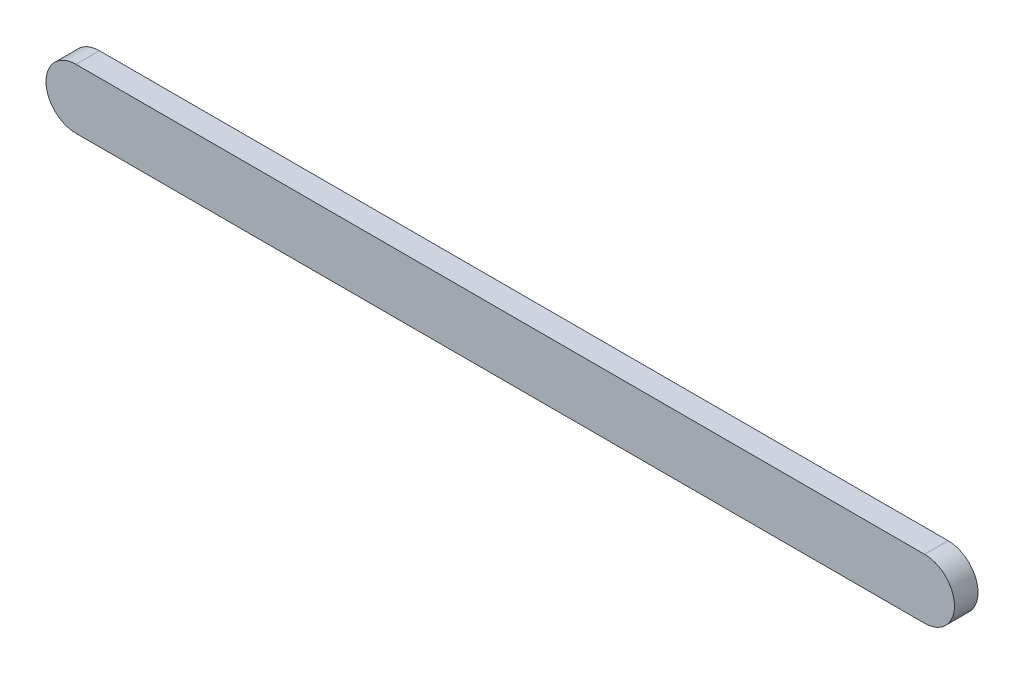
ISO-10303-21;
HEADER;
FILE_DESCRIPTION(('STEP AP214'),'2;1');
FILE_NAME('part.step','',(''),(''),'','','');
FILE_SCHEMA(('AUTOMOTIVE_DESIGN { 1 0 10303 214 1 1 1 1 }'));
ENDSEC;
DATA;
#1=APPLICATION_CONTEXT('core data for automotive mechanical design processes');
#2=APPLICATION_PROTOCOL_DEFINITION('international standard','automotive_design',2000,#1);
#3=PRODUCT_CONTEXT('',#1,'mechanical');
#4=PRODUCT('Part','Part','',(#3));
#5=PRODUCT_RELATED_PRODUCT_CATEGORY('part','',(#4));
#6=PRODUCT_DEFINITION_FORMATION('','',#4);
#7=PRODUCT_DEFINITION_CONTEXT('part definition',#1,'design');
#8=PRODUCT_DEFINITION('design','',#6,#7);
#9=PRODUCT_DEFINITION_SHAPE('','',#8);
#10=(LENGTH_UNIT() NAMED_UNIT(*) SI_UNIT(.MILLI.,.METRE.));
#11=(NAMED_UNIT(*) PLANE_ANGLE_UNIT() SI_UNIT($,.RADIAN.));
#12=(NAMED_UNIT(*) SI_UNIT($,.STERADIAN.) SOLID_ANGLE_UNIT());
#13=UNCERTAINTY_MEASURE_WITH_UNIT(LENGTH_MEASURE(1.E-05),#10,'distance_accuracy_value','');
#14=(GEOMETRIC_REPRESENTATION_CONTEXT(3) GLOBAL_UNCERTAINTY_ASSIGNED_CONTEXT((#13)) GLOBAL_UNIT_ASSIGNED_CONTEXT((#10,
#11,#12)) REPRESENTATION_CONTEXT('',''));
#15=CARTESIAN_POINT('',(0.,0.,0.));
#16=DIRECTION('',(0.,0.,1.));
#17=DIRECTION('',(1.,0.,0.));
#18=AXIS2_PLACEMENT_3D('',#15,#16,#17);
#19=CARTESIAN_POINT('',(92.202,107.569,0.));
#20=DIRECTION('',(0.,1.,0.));
#21=DIRECTION('',(1.,0.,0.));
#22=AXIS2_PLACEMENT_3D('',#19,#20,#21);
#23=PLANE('',#22);
#24=DIRECTION('',(1.,0.,0.));
#25=VECTOR('',#24,1.);
#26=CARTESIAN_POINT('',(92.202,107.569,0.1999996));
#27=LINE('',#26,#25);
#28=CARTESIAN_POINT('',(92.202,107.569,0.1999996));
#29=VERTEX_POINT('',#28);
#30=CARTESIAN_POINT('',(99.4156,107.569,0.1999996));
#31=VERTEX_POINT('',#30);
#32=EDGE_CURVE('E11',#29,#31,#27,.T.);
#33=ORIENTED_EDGE('',*,*,#32,.F.);
#34=DIRECTION('',(0.,0.,1.));
#35=VECTOR('',#34,1.);
#36=CARTESIAN_POINT('',(92.202,107.569,0.));
#37=LINE('',#36,#35);
#38=CARTESIAN_POINT('',(92.202,107.569,0.));
#39=VERTEX_POINT('',#38);
#40=EDGE_CURVE('E24',#39,#29,#37,.T.);
#41=ORIENTED_EDGE('',*,*,#40,.F.);
#42=DIRECTION('',(1.,0.,0.));
#43=VECTOR('',#42,1.);
#44=CARTESIAN_POINT('',(92.202,107.569,0.));
#45=LINE('',#44,#43);
#46=CARTESIAN_POINT('',(99.4156,107.569,0.));
#47=VERTEX_POINT('',#46);
#48=EDGE_CURVE('E75',#39,#47,#45,.T.);
#49=ORIENTED_EDGE('',*,*,#48,.T.);
#50=DIRECTION('',(0.,0.,1.));
#51=VECTOR('',#50,1.);
#52=CARTESIAN_POINT('',(99.4156,107.569,0.));
#53=LINE('',#52,#51);
#54=EDGE_CURVE('E37',#47,#31,#53,.T.);
#55=ORIENTED_EDGE('',*,*,#54,.T.);
#56=EDGE_LOOP('',(#33,#41,#49,#55));
#57=FACE_BOUND('',#56,.T.);
#58=ADVANCED_FACE('F17',(#57),#23,.F.);
#59=CARTESIAN_POINT('',(99.4156,107.823,0.));
#60=DIRECTION('',(0.,0.,-1.));
#61=DIRECTION('',(0.,-1.,0.));
#62=AXIS2_PLACEMENT_3D('',#59,#60,#61);
#63=CYLINDRICAL_SURFACE('',#62,0.254);
#64=CARTESIAN_POINT('',(99.4156,107.823,0.1999996));
#65=DIRECTION('',(0.,0.,1.));
#66=DIRECTION('',(0.,-1.,0.));
#67=AXIS2_PLACEMENT_3D('',#64,#65,#66);
#68=CIRCLE('',#67,0.254);
#69=CARTESIAN_POINT('',(99.4156,108.077,0.1999996));
#70=VERTEX_POINT('',#69);
#71=EDGE_CURVE('E83',#31,#70,#68,.T.);
#72=ORIENTED_EDGE('',*,*,#71,.F.);
#73=ORIENTED_EDGE('',*,*,#54,.F.);
#74=CARTESIAN_POINT('',(99.4156,107.823,0.));
#75=DIRECTION('',(0.,0.,1.));
#76=DIRECTION('',(0.,-1.,0.));
#77=AXIS2_PLACEMENT_3D('',#74,#75,#76);
#78=CIRCLE('',#77,0.254);
#79=CARTESIAN_POINT('',(99.4156,108.077,0.));
#80=VERTEX_POINT('',#79);
#81=EDGE_CURVE('E81',#47,#80,#78,.T.);
#82=ORIENTED_EDGE('',*,*,#81,.T.);
#83=DIRECTION('',(0.,0.,1.));
#84=VECTOR('',#83,1.);
#85=CARTESIAN_POINT('',(99.4156,108.077,0.));
#86=LINE('',#85,#84);
#87=EDGE_CURVE('E67',#80,#70,#86,.T.);
#88=ORIENTED_EDGE('',*,*,#87,.T.);
#89=EDGE_LOOP('',(#72,#73,#82,#88));
#90=FACE_BOUND('',#89,.T.);
#91=ADVANCED_FACE('F89',(#90),#63,.T.);
#92=CARTESIAN_POINT('',(99.4156,108.077,0.));
#93=DIRECTION('',(0.,-1.,0.));
#94=DIRECTION('',(-1.,0.,0.));
#95=AXIS2_PLACEMENT_3D('',#92,#93,#94);
#96=PLANE('',#95);
#97=DIRECTION('',(-1.,0.,0.));
#98=VECTOR('',#97,1.);
#99=CARTESIAN_POINT('',(99.4156,108.077,0.1999996));
#100=LINE('',#99,#98);
#101=CARTESIAN_POINT('',(92.202,108.077,0.1999996));
#102=VERTEX_POINT('',#101);
#103=EDGE_CURVE('E71',#70,#102,#100,.T.);
#104=ORIENTED_EDGE('',*,*,#103,.F.);
#105=ORIENTED_EDGE('',*,*,#87,.F.);
#106=DIRECTION('',(-1.,0.,0.));
#107=VECTOR('',#106,1.);
#108=CARTESIAN_POINT('',(99.4156,108.077,0.));
#109=LINE('',#108,#107);
#110=CARTESIAN_POINT('',(92.202,108.077,0.));
#111=VERTEX_POINT('',#110);
#112=EDGE_CURVE('E63',#80,#111,#109,.T.);
#113=ORIENTED_EDGE('',*,*,#112,.T.);
#114=DIRECTION('',(0.,0.,1.));
#115=VECTOR('',#114,1.);
#116=CARTESIAN_POINT('',(92.202,108.077,0.));
#117=LINE('',#116,#115);
#118=EDGE_CURVE('E53',#111,#102,#117,.T.);
#119=ORIENTED_EDGE('',*,*,#118,.T.);
#120=EDGE_LOOP('',(#104,#105,#113,#119));
#121=FACE_BOUND('',#120,.T.);
#122=ADVANCED_FACE('F66',(#121),#96,.F.);
#123=CARTESIAN_POINT('',(92.202,107.823,0.));
#124=DIRECTION('',(0.,0.,-1.));
#125=DIRECTION('',(0.,1.,0.));
#126=AXIS2_PLACEMENT_3D('',#123,#124,#125);
#127=CYLINDRICAL_SURFACE('',#126,0.253999999999995);
#128=CARTESIAN_POINT('',(92.202,107.823,0.1999996));
#129=DIRECTION('',(0.,0.,1.));
#130=DIRECTION('',(0.,1.,0.));
#131=AXIS2_PLACEMENT_3D('',#128,#129,#130);
#132=CIRCLE('',#131,0.253999999999995);
#133=EDGE_CURVE('E59',#102,#29,#132,.T.);
#134=ORIENTED_EDGE('',*,*,#133,.F.);
#135=ORIENTED_EDGE('',*,*,#118,.F.);
#136=CARTESIAN_POINT('',(92.202,107.823,0.));
#137=DIRECTION('',(0.,0.,1.));
#138=DIRECTION('',(0.,1.,0.));
#139=AXIS2_PLACEMENT_3D('',#136,#137,#138);
#140=CIRCLE('',#139,0.253999999999995);
#141=EDGE_CURVE('E57',#111,#39,#140,.T.);
#142=ORIENTED_EDGE('',*,*,#141,.T.);
#143=ORIENTED_EDGE('',*,*,#40,.T.);
#144=EDGE_LOOP('',(#134,#135,#142,#143));
#145=FACE_BOUND('',#144,.T.);
#146=ADVANCED_FACE('F55',(#145),#127,.T.);
#147=CARTESIAN_POINT('',(92.202,107.569,0.));
#148=DIRECTION('',(0.,0.,-1.));
#149=DIRECTION('',(-1.,0.,0.));
#150=AXIS2_PLACEMENT_3D('',#147,#148,#149);
#151=PLANE('',#150);
#152=ORIENTED_EDGE('',*,*,#141,.F.);
#153=ORIENTED_EDGE('',*,*,#112,.F.);
#154=ORIENTED_EDGE('',*,*,#81,.F.);
#155=ORIENTED_EDGE('',*,*,#48,.F.);
#156=EDGE_LOOP('',(#152,#153,#154,#155));
#157=FACE_BOUND('',#156,.T.);
#158=ADVANCED_FACE('F74',(#157),#151,.T.);
#159=CARTESIAN_POINT('',(92.202,107.569,0.1999996));
#160=DIRECTION('',(0.,0.,-1.));
#161=DIRECTION('',(-1.,0.,0.));
#162=AXIS2_PLACEMENT_3D('',#159,#160,#161);
#163=PLANE('',#162);
#164=ORIENTED_EDGE('',*,*,#32,.T.);
#165=ORIENTED_EDGE('',*,*,#71,.T.);
#166=ORIENTED_EDGE('',*,*,#103,.T.);
#167=ORIENTED_EDGE('',*,*,#133,.T.);
#168=EDGE_LOOP('',(#164,#165,#166,#167));
#169=FACE_BOUND('',#168,.T.);
#170=ADVANCED_FACE('F91',(#169),#163,.F.);
#171=CLOSED_SHELL('',(#58,#91,#122,#146,#158,#170));
#172=MANIFOLD_SOLID_BREP('B1',#171);
#173=ADVANCED_BREP_SHAPE_REPRESENTATION('',(#18,#172),#14);
#174=SHAPE_DEFINITION_REPRESENTATION(#9,#173);
ENDSEC;
END-ISO-10303-21;
